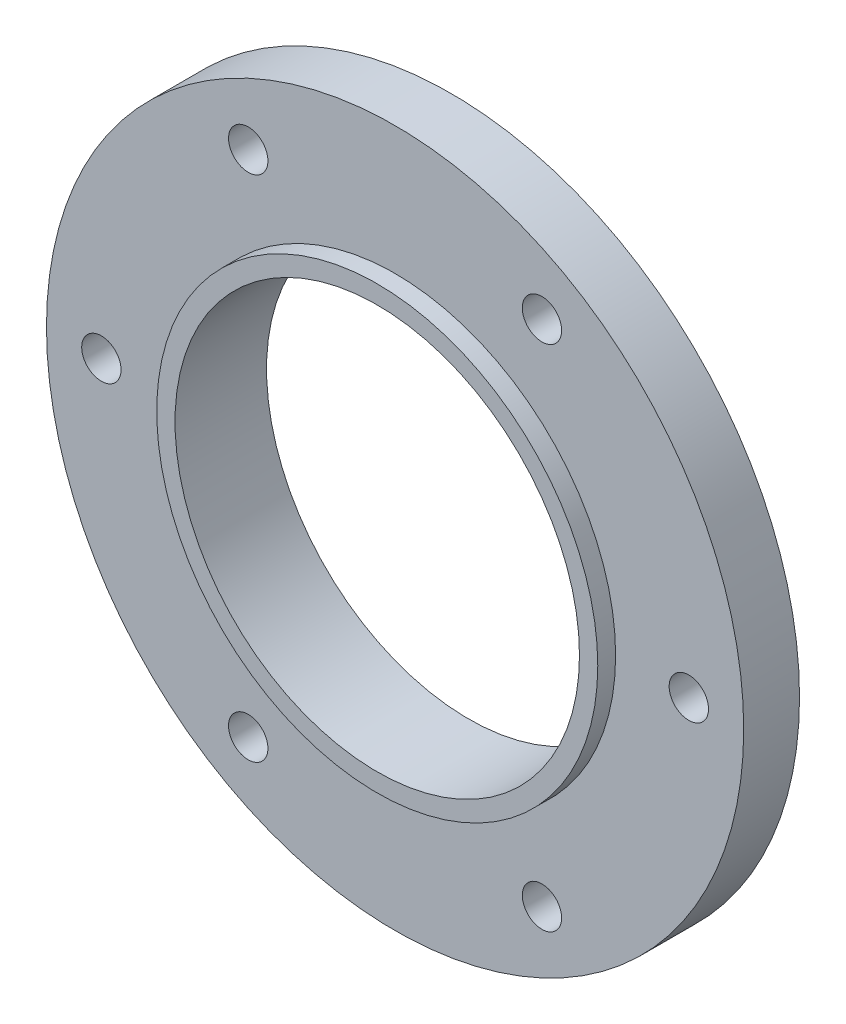
ISO-10303-21;
HEADER;
FILE_DESCRIPTION(('STEP AP214'),'2;1');
FILE_NAME('part.step','',(''),(''),'','','');
FILE_SCHEMA(('AUTOMOTIVE_DESIGN { 1 0 10303 214 1 1 1 1 }'));
ENDSEC;
DATA;
#1=APPLICATION_CONTEXT('core data for automotive mechanical design processes');
#2=APPLICATION_PROTOCOL_DEFINITION('international standard','automotive_design',2000,#1);
#3=PRODUCT_CONTEXT('',#1,'mechanical');
#4=PRODUCT('Part','Part','',(#3));
#5=PRODUCT_RELATED_PRODUCT_CATEGORY('part','',(#4));
#6=PRODUCT_DEFINITION_FORMATION('','',#4);
#7=PRODUCT_DEFINITION_CONTEXT('part definition',#1,'design');
#8=PRODUCT_DEFINITION('design','',#6,#7);
#9=PRODUCT_DEFINITION_SHAPE('','',#8);
#10=(LENGTH_UNIT() NAMED_UNIT(*) SI_UNIT(.MILLI.,.METRE.));
#11=(NAMED_UNIT(*) PLANE_ANGLE_UNIT() SI_UNIT($,.RADIAN.));
#12=(NAMED_UNIT(*) SI_UNIT($,.STERADIAN.) SOLID_ANGLE_UNIT());
#13=UNCERTAINTY_MEASURE_WITH_UNIT(LENGTH_MEASURE(1.E-05),#10,'distance_accuracy_value','');
#14=(GEOMETRIC_REPRESENTATION_CONTEXT(3) GLOBAL_UNCERTAINTY_ASSIGNED_CONTEXT((#13)) GLOBAL_UNIT_ASSIGNED_CONTEXT((#10,
#11,#12)) REPRESENTATION_CONTEXT('',''));
#15=CARTESIAN_POINT('',(0.,0.,0.));
#16=DIRECTION('',(0.,0.,1.));
#17=DIRECTION('',(1.,0.,0.));
#18=AXIS2_PLACEMENT_3D('',#15,#16,#17);
#19=CARTESIAN_POINT('',(0.,0.,0.));
#20=DIRECTION('',(0.,0.,1.));
#21=DIRECTION('',(1.,0.,0.));
#22=AXIS2_PLACEMENT_3D('',#19,#20,#21);
#23=CYLINDRICAL_SURFACE('',#22,38.1);
#24=CARTESIAN_POINT('',(0.,0.,-6.1));
#25=DIRECTION('',(0.,0.,1.));
#26=DIRECTION('',(1.,0.,0.));
#27=AXIS2_PLACEMENT_3D('',#24,#25,#26);
#28=CIRCLE('',#27,38.1);
#29=CARTESIAN_POINT('',(38.1,0.,-6.1));
#30=VERTEX_POINT('',#29);
#31=EDGE_CURVE('E67',#30,#30,#28,.T.);
#32=ORIENTED_EDGE('',*,*,#31,.T.);
#33=EDGE_LOOP('',(#32));
#34=FACE_BOUND('',#33,.T.);
#35=CARTESIAN_POINT('',(0.,0.,0.));
#36=DIRECTION('',(0.,0.,1.));
#37=DIRECTION('',(1.,0.,0.));
#38=AXIS2_PLACEMENT_3D('',#35,#36,#37);
#39=CIRCLE('',#38,38.1);
#40=CARTESIAN_POINT('',(38.1,0.,0.));
#41=VERTEX_POINT('',#40);
#42=EDGE_CURVE('E10',#41,#41,#39,.T.);
#43=ORIENTED_EDGE('',*,*,#42,.F.);
#44=EDGE_LOOP('',(#43));
#45=FACE_BOUND('',#44,.T.);
#46=ADVANCED_FACE('F39',(#34,#45),#23,.T.);
#47=CARTESIAN_POINT('',(24.1,0.,0.));
#48=DIRECTION('',(0.,0.,1.));
#49=DIRECTION('',(1.,0.,0.));
#50=AXIS2_PLACEMENT_3D('',#47,#48,#49);
#51=PLANE('',#50);
#52=CARTESIAN_POINT('',(32.1,0.,0.));
#53=DIRECTION('',(0.,0.,1.));
#54=DIRECTION('',(1.,0.,0.));
#55=AXIS2_PLACEMENT_3D('',#52,#53,#54);
#56=CIRCLE('',#55,2.15);
#57=CARTESIAN_POINT('',(34.25,0.,0.));
#58=VERTEX_POINT('',#57);
#59=EDGE_CURVE('E70',#58,#58,#56,.T.);
#60=ORIENTED_EDGE('',*,*,#59,.F.);
#61=EDGE_LOOP('',(#60));
#62=FACE_BOUND('',#61,.T.);
#63=CARTESIAN_POINT('',(16.05,-27.7994154614805,0.));
#64=DIRECTION('',(0.,0.,1.));
#65=DIRECTION('',(1.,0.,0.));
#66=AXIS2_PLACEMENT_3D('',#63,#64,#65);
#67=CIRCLE('',#66,2.15);
#68=CARTESIAN_POINT('',(18.2,-27.7994154614805,0.));
#69=VERTEX_POINT('',#68);
#70=EDGE_CURVE('E73',#69,#69,#67,.T.);
#71=ORIENTED_EDGE('',*,*,#70,.F.);
#72=EDGE_LOOP('',(#71));
#73=FACE_BOUND('',#72,.T.);
#74=CARTESIAN_POINT('',(-16.05,-27.7994154614805,0.));
#75=DIRECTION('',(0.,0.,1.));
#76=DIRECTION('',(1.,0.,0.));
#77=AXIS2_PLACEMENT_3D('',#74,#75,#76);
#78=CIRCLE('',#77,2.15);
#79=CARTESIAN_POINT('',(-13.9,-27.7994154614805,0.));
#80=VERTEX_POINT('',#79);
#81=EDGE_CURVE('E76',#80,#80,#78,.T.);
#82=ORIENTED_EDGE('',*,*,#81,.F.);
#83=EDGE_LOOP('',(#82));
#84=FACE_BOUND('',#83,.T.);
#85=CARTESIAN_POINT('',(-32.1,0.,0.));
#86=DIRECTION('',(0.,0.,1.));
#87=DIRECTION('',(1.,0.,0.));
#88=AXIS2_PLACEMENT_3D('',#85,#86,#87);
#89=CIRCLE('',#88,2.15);
#90=CARTESIAN_POINT('',(-29.95,0.,0.));
#91=VERTEX_POINT('',#90);
#92=EDGE_CURVE('E79',#91,#91,#89,.T.);
#93=ORIENTED_EDGE('',*,*,#92,.F.);
#94=EDGE_LOOP('',(#93));
#95=FACE_BOUND('',#94,.T.);
#96=CARTESIAN_POINT('',(-16.05,27.7994154614805,0.));
#97=DIRECTION('',(0.,0.,1.));
#98=DIRECTION('',(1.,0.,0.));
#99=AXIS2_PLACEMENT_3D('',#96,#97,#98);
#100=CIRCLE('',#99,2.15);
#101=CARTESIAN_POINT('',(-13.9,27.7994154614805,0.));
#102=VERTEX_POINT('',#101);
#103=EDGE_CURVE('E82',#102,#102,#100,.T.);
#104=ORIENTED_EDGE('',*,*,#103,.F.);
#105=EDGE_LOOP('',(#104));
#106=FACE_BOUND('',#105,.T.);
#107=CARTESIAN_POINT('',(16.05,27.7994154614805,0.));
#108=DIRECTION('',(0.,0.,1.));
#109=DIRECTION('',(1.,0.,0.));
#110=AXIS2_PLACEMENT_3D('',#107,#108,#109);
#111=CIRCLE('',#110,2.15);
#112=CARTESIAN_POINT('',(18.2,27.7994154614805,0.));
#113=VERTEX_POINT('',#112);
#114=EDGE_CURVE('E85',#113,#113,#111,.T.);
#115=ORIENTED_EDGE('',*,*,#114,.F.);
#116=EDGE_LOOP('',(#115));
#117=FACE_BOUND('',#116,.T.);
#118=ORIENTED_EDGE('',*,*,#42,.T.);
#119=EDGE_LOOP('',(#118));
#120=FACE_BOUND('',#119,.T.);
#121=CARTESIAN_POINT('',(0.,0.,0.));
#122=DIRECTION('',(0.,0.,1.));
#123=DIRECTION('',(1.,0.,0.));
#124=AXIS2_PLACEMENT_3D('',#121,#122,#123);
#125=CIRCLE('',#124,24.1);
#126=CARTESIAN_POINT('',(24.1,0.,0.));
#127=VERTEX_POINT('',#126);
#128=EDGE_CURVE('E45',#127,#127,#125,.T.);
#129=ORIENTED_EDGE('',*,*,#128,.F.);
#130=EDGE_LOOP('',(#129));
#131=FACE_BOUND('',#130,.T.);
#132=ADVANCED_FACE('F131',(#62,#73,#84,#95,#106,#117,#120,#131),#51,.T.);
#133=CARTESIAN_POINT('',(0.,0.,0.));
#134=DIRECTION('',(0.,0.,1.));
#135=DIRECTION('',(1.,0.,0.));
#136=AXIS2_PLACEMENT_3D('',#133,#134,#135);
#137=CYLINDRICAL_SURFACE('',#136,24.1);
#138=ORIENTED_EDGE('',*,*,#128,.T.);
#139=EDGE_LOOP('',(#138));
#140=FACE_BOUND('',#139,.T.);
#141=CARTESIAN_POINT('',(0.,0.,1.95));
#142=DIRECTION('',(0.,0.,1.));
#143=DIRECTION('',(1.,0.,0.));
#144=AXIS2_PLACEMENT_3D('',#141,#142,#143);
#145=CIRCLE('',#144,24.1);
#146=CARTESIAN_POINT('',(24.1,0.,1.95));
#147=VERTEX_POINT('',#146);
#148=EDGE_CURVE('E49',#147,#147,#145,.T.);
#149=ORIENTED_EDGE('',*,*,#148,.F.);
#150=EDGE_LOOP('',(#149));
#151=FACE_BOUND('',#150,.T.);
#152=ADVANCED_FACE('F136',(#140,#151),#137,.T.);
#153=CARTESIAN_POINT('',(22.1,0.,1.95));
#154=DIRECTION('',(0.,0.,1.));
#155=DIRECTION('',(1.,0.,0.));
#156=AXIS2_PLACEMENT_3D('',#153,#154,#155);
#157=PLANE('',#156);
#158=ORIENTED_EDGE('',*,*,#148,.T.);
#159=EDGE_LOOP('',(#158));
#160=FACE_BOUND('',#159,.T.);
#161=CARTESIAN_POINT('',(0.,0.,1.95));
#162=DIRECTION('',(0.,0.,1.));
#163=DIRECTION('',(1.,0.,0.));
#164=AXIS2_PLACEMENT_3D('',#161,#162,#163);
#165=CIRCLE('',#164,22.1);
#166=CARTESIAN_POINT('',(22.1,0.,1.95));
#167=VERTEX_POINT('',#166);
#168=EDGE_CURVE('E53',#167,#167,#165,.T.);
#169=ORIENTED_EDGE('',*,*,#168,.F.);
#170=EDGE_LOOP('',(#169));
#171=FACE_BOUND('',#170,.T.);
#172=ADVANCED_FACE('F141',(#160,#171),#157,.T.);
#173=CARTESIAN_POINT('',(0.,0.,0.));
#174=DIRECTION('',(0.,0.,1.));
#175=DIRECTION('',(1.,0.,0.));
#176=AXIS2_PLACEMENT_3D('',#173,#174,#175);
#177=CYLINDRICAL_SURFACE('',#176,22.1);
#178=ORIENTED_EDGE('',*,*,#168,.T.);
#179=EDGE_LOOP('',(#178));
#180=FACE_BOUND('',#179,.T.);
#181=CARTESIAN_POINT('',(0.,0.,-8.05));
#182=DIRECTION('',(0.,0.,1.));
#183=DIRECTION('',(1.,0.,0.));
#184=AXIS2_PLACEMENT_3D('',#181,#182,#183);
#185=CIRCLE('',#184,22.1);
#186=CARTESIAN_POINT('',(22.1,0.,-8.05));
#187=VERTEX_POINT('',#186);
#188=EDGE_CURVE('E58',#187,#187,#185,.T.);
#189=ORIENTED_EDGE('',*,*,#188,.F.);
#190=EDGE_LOOP('',(#189));
#191=FACE_BOUND('',#190,.T.);
#192=ADVANCED_FACE('F148',(#180,#191),#177,.F.);
#193=CARTESIAN_POINT('',(22.1,0.,-8.05));
#194=DIRECTION('',(0.,0.,-1.));
#195=DIRECTION('',(-1.,0.,0.));
#196=AXIS2_PLACEMENT_3D('',#193,#194,#195);
#197=PLANE('',#196);
#198=ORIENTED_EDGE('',*,*,#188,.T.);
#199=EDGE_LOOP('',(#198));
#200=FACE_BOUND('',#199,.T.);
#201=CARTESIAN_POINT('',(0.,0.,-8.05));
#202=DIRECTION('',(0.,0.,1.));
#203=DIRECTION('',(1.,0.,0.));
#204=AXIS2_PLACEMENT_3D('',#201,#202,#203);
#205=CIRCLE('',#204,24.1);
#206=CARTESIAN_POINT('',(24.1,0.,-8.05));
#207=VERTEX_POINT('',#206);
#208=EDGE_CURVE('E61',#207,#207,#205,.T.);
#209=ORIENTED_EDGE('',*,*,#208,.F.);
#210=EDGE_LOOP('',(#209));
#211=FACE_BOUND('',#210,.T.);
#212=ADVANCED_FACE('F152',(#200,#211),#197,.T.);
#213=CARTESIAN_POINT('',(0.,0.,0.));
#214=DIRECTION('',(0.,0.,1.));
#215=DIRECTION('',(1.,0.,0.));
#216=AXIS2_PLACEMENT_3D('',#213,#214,#215);
#217=CYLINDRICAL_SURFACE('',#216,24.1);
#218=ORIENTED_EDGE('',*,*,#208,.T.);
#219=EDGE_LOOP('',(#218));
#220=FACE_BOUND('',#219,.T.);
#221=CARTESIAN_POINT('',(0.,0.,-6.1));
#222=DIRECTION('',(0.,0.,1.));
#223=DIRECTION('',(1.,0.,0.));
#224=AXIS2_PLACEMENT_3D('',#221,#222,#223);
#225=CIRCLE('',#224,24.1);
#226=CARTESIAN_POINT('',(24.1,0.,-6.1));
#227=VERTEX_POINT('',#226);
#228=EDGE_CURVE('E64',#227,#227,#225,.T.);
#229=ORIENTED_EDGE('',*,*,#228,.F.);
#230=EDGE_LOOP('',(#229));
#231=FACE_BOUND('',#230,.T.);
#232=ADVANCED_FACE('F113',(#220,#231),#217,.T.);
#233=CARTESIAN_POINT('',(24.1,0.,-6.1));
#234=DIRECTION('',(0.,0.,-1.));
#235=DIRECTION('',(-1.,0.,0.));
#236=AXIS2_PLACEMENT_3D('',#233,#234,#235);
#237=PLANE('',#236);
#238=CARTESIAN_POINT('',(32.1,0.,-6.1));
#239=DIRECTION('',(0.,0.,-1.));
#240=DIRECTION('',(-1.,0.,0.));
#241=AXIS2_PLACEMENT_3D('',#238,#239,#240);
#242=CIRCLE('',#241,2.15);
#243=CARTESIAN_POINT('',(29.95,0.,-6.1));
#244=VERTEX_POINT('',#243);
#245=EDGE_CURVE('E88',#244,#244,#242,.T.);
#246=ORIENTED_EDGE('',*,*,#245,.F.);
#247=EDGE_LOOP('',(#246));
#248=FACE_BOUND('',#247,.T.);
#249=CARTESIAN_POINT('',(16.05,-27.7994154614805,-6.1));
#250=DIRECTION('',(0.,0.,-1.));
#251=DIRECTION('',(-1.,0.,0.));
#252=AXIS2_PLACEMENT_3D('',#249,#250,#251);
#253=CIRCLE('',#252,2.15);
#254=CARTESIAN_POINT('',(13.9,-27.7994154614805,-6.1));
#255=VERTEX_POINT('',#254);
#256=EDGE_CURVE('E93',#255,#255,#253,.T.);
#257=ORIENTED_EDGE('',*,*,#256,.F.);
#258=EDGE_LOOP('',(#257));
#259=FACE_BOUND('',#258,.T.);
#260=CARTESIAN_POINT('',(-16.05,-27.7994154614805,-6.1));
#261=DIRECTION('',(0.,0.,-1.));
#262=DIRECTION('',(-1.,0.,0.));
#263=AXIS2_PLACEMENT_3D('',#260,#261,#262);
#264=CIRCLE('',#263,2.15);
#265=CARTESIAN_POINT('',(-18.2,-27.7994154614805,-6.1));
#266=VERTEX_POINT('',#265);
#267=EDGE_CURVE('E89',#266,#266,#264,.T.);
#268=ORIENTED_EDGE('',*,*,#267,.F.);
#269=EDGE_LOOP('',(#268));
#270=FACE_BOUND('',#269,.T.);
#271=CARTESIAN_POINT('',(-32.1,0.,-6.1));
#272=DIRECTION('',(0.,0.,-1.));
#273=DIRECTION('',(-1.,0.,0.));
#274=AXIS2_PLACEMENT_3D('',#271,#272,#273);
#275=CIRCLE('',#274,2.15);
#276=CARTESIAN_POINT('',(-34.25,0.,-6.1));
#277=VERTEX_POINT('',#276);
#278=EDGE_CURVE('E92',#277,#277,#275,.T.);
#279=ORIENTED_EDGE('',*,*,#278,.F.);
#280=EDGE_LOOP('',(#279));
#281=FACE_BOUND('',#280,.T.);
#282=CARTESIAN_POINT('',(-16.05,27.7994154614805,-6.1));
#283=DIRECTION('',(0.,0.,-1.));
#284=DIRECTION('',(-1.,0.,0.));
#285=AXIS2_PLACEMENT_3D('',#282,#283,#284);
#286=CIRCLE('',#285,2.15);
#287=CARTESIAN_POINT('',(-18.2,27.7994154614805,-6.1));
#288=VERTEX_POINT('',#287);
#289=EDGE_CURVE('E96',#288,#288,#286,.T.);
#290=ORIENTED_EDGE('',*,*,#289,.F.);
#291=EDGE_LOOP('',(#290));
#292=FACE_BOUND('',#291,.T.);
#293=CARTESIAN_POINT('',(16.05,27.7994154614805,-6.1));
#294=DIRECTION('',(0.,0.,-1.));
#295=DIRECTION('',(-1.,0.,0.));
#296=AXIS2_PLACEMENT_3D('',#293,#294,#295);
#297=CIRCLE('',#296,2.15);
#298=CARTESIAN_POINT('',(13.9,27.7994154614805,-6.1));
#299=VERTEX_POINT('',#298);
#300=EDGE_CURVE('E99',#299,#299,#297,.T.);
#301=ORIENTED_EDGE('',*,*,#300,.F.);
#302=EDGE_LOOP('',(#301));
#303=FACE_BOUND('',#302,.T.);
#304=ORIENTED_EDGE('',*,*,#228,.T.);
#305=EDGE_LOOP('',(#304));
#306=FACE_BOUND('',#305,.T.);
#307=ORIENTED_EDGE('',*,*,#31,.F.);
#308=EDGE_LOOP('',(#307));
#309=FACE_BOUND('',#308,.T.);
#310=ADVANCED_FACE('F109',(#248,#259,#270,#281,#292,#303,#306,#309),#237,.T.);
#311=CARTESIAN_POINT('',(16.05,27.7994154614805,3.9));
#312=DIRECTION('',(0.,0.,-1.));
#313=DIRECTION('',(-1.,0.,0.));
#314=AXIS2_PLACEMENT_3D('',#311,#312,#313);
#315=CYLINDRICAL_SURFACE('',#314,2.15);
#316=ORIENTED_EDGE('',*,*,#114,.T.);
#317=EDGE_LOOP('',(#316));
#318=FACE_BOUND('',#317,.T.);
#319=ORIENTED_EDGE('',*,*,#300,.T.);
#320=EDGE_LOOP('',(#319));
#321=FACE_BOUND('',#320,.T.);
#322=ADVANCED_FACE('F112',(#318,#321),#315,.F.);
#323=CARTESIAN_POINT('',(-16.05,27.7994154614805,3.9));
#324=DIRECTION('',(0.,0.,-1.));
#325=DIRECTION('',(-1.,0.,0.));
#326=AXIS2_PLACEMENT_3D('',#323,#324,#325);
#327=CYLINDRICAL_SURFACE('',#326,2.15);
#328=ORIENTED_EDGE('',*,*,#103,.T.);
#329=EDGE_LOOP('',(#328));
#330=FACE_BOUND('',#329,.T.);
#331=ORIENTED_EDGE('',*,*,#289,.T.);
#332=EDGE_LOOP('',(#331));
#333=FACE_BOUND('',#332,.T.);
#334=ADVANCED_FACE('F167',(#330,#333),#327,.F.);
#335=CARTESIAN_POINT('',(-32.1,0.,3.9));
#336=DIRECTION('',(0.,0.,-1.));
#337=DIRECTION('',(-1.,0.,0.));
#338=AXIS2_PLACEMENT_3D('',#335,#336,#337);
#339=CYLINDRICAL_SURFACE('',#338,2.15);
#340=ORIENTED_EDGE('',*,*,#92,.T.);
#341=EDGE_LOOP('',(#340));
#342=FACE_BOUND('',#341,.T.);
#343=ORIENTED_EDGE('',*,*,#278,.T.);
#344=EDGE_LOOP('',(#343));
#345=FACE_BOUND('',#344,.T.);
#346=ADVANCED_FACE('F163',(#342,#345),#339,.F.);
#347=CARTESIAN_POINT('',(-16.05,-27.7994154614805,3.9));
#348=DIRECTION('',(0.,0.,-1.));
#349=DIRECTION('',(-1.,0.,0.));
#350=AXIS2_PLACEMENT_3D('',#347,#348,#349);
#351=CYLINDRICAL_SURFACE('',#350,2.15);
#352=ORIENTED_EDGE('',*,*,#81,.T.);
#353=EDGE_LOOP('',(#352));
#354=FACE_BOUND('',#353,.T.);
#355=ORIENTED_EDGE('',*,*,#267,.T.);
#356=EDGE_LOOP('',(#355));
#357=FACE_BOUND('',#356,.T.);
#358=ADVANCED_FACE('F159',(#354,#357),#351,.F.);
#359=CARTESIAN_POINT('',(16.05,-27.7994154614805,3.9));
#360=DIRECTION('',(0.,0.,-1.));
#361=DIRECTION('',(-1.,0.,0.));
#362=AXIS2_PLACEMENT_3D('',#359,#360,#361);
#363=CYLINDRICAL_SURFACE('',#362,2.15);
#364=ORIENTED_EDGE('',*,*,#70,.T.);
#365=EDGE_LOOP('',(#364));
#366=FACE_BOUND('',#365,.T.);
#367=ORIENTED_EDGE('',*,*,#256,.T.);
#368=EDGE_LOOP('',(#367));
#369=FACE_BOUND('',#368,.T.);
#370=ADVANCED_FACE('F162',(#366,#369),#363,.F.);
#371=CARTESIAN_POINT('',(32.1,0.,3.9));
#372=DIRECTION('',(0.,0.,-1.));
#373=DIRECTION('',(-1.,0.,0.));
#374=AXIS2_PLACEMENT_3D('',#371,#372,#373);
#375=CYLINDRICAL_SURFACE('',#374,2.15);
#376=ORIENTED_EDGE('',*,*,#59,.T.);
#377=EDGE_LOOP('',(#376));
#378=FACE_BOUND('',#377,.T.);
#379=ORIENTED_EDGE('',*,*,#245,.T.);
#380=EDGE_LOOP('',(#379));
#381=FACE_BOUND('',#380,.T.);
#382=ADVANCED_FACE('F107',(#378,#381),#375,.F.);
#383=CLOSED_SHELL('',(#46,#132,#152,#172,#192,#212,#232,#310,#322,#334,#346,#358,#370,#382));
#384=MANIFOLD_SOLID_BREP('B2',#383);
#385=ADVANCED_BREP_SHAPE_REPRESENTATION('',(#18,#384),#14);
#386=SHAPE_DEFINITION_REPRESENTATION(#9,#385);
ENDSEC;
END-ISO-10303-21;
